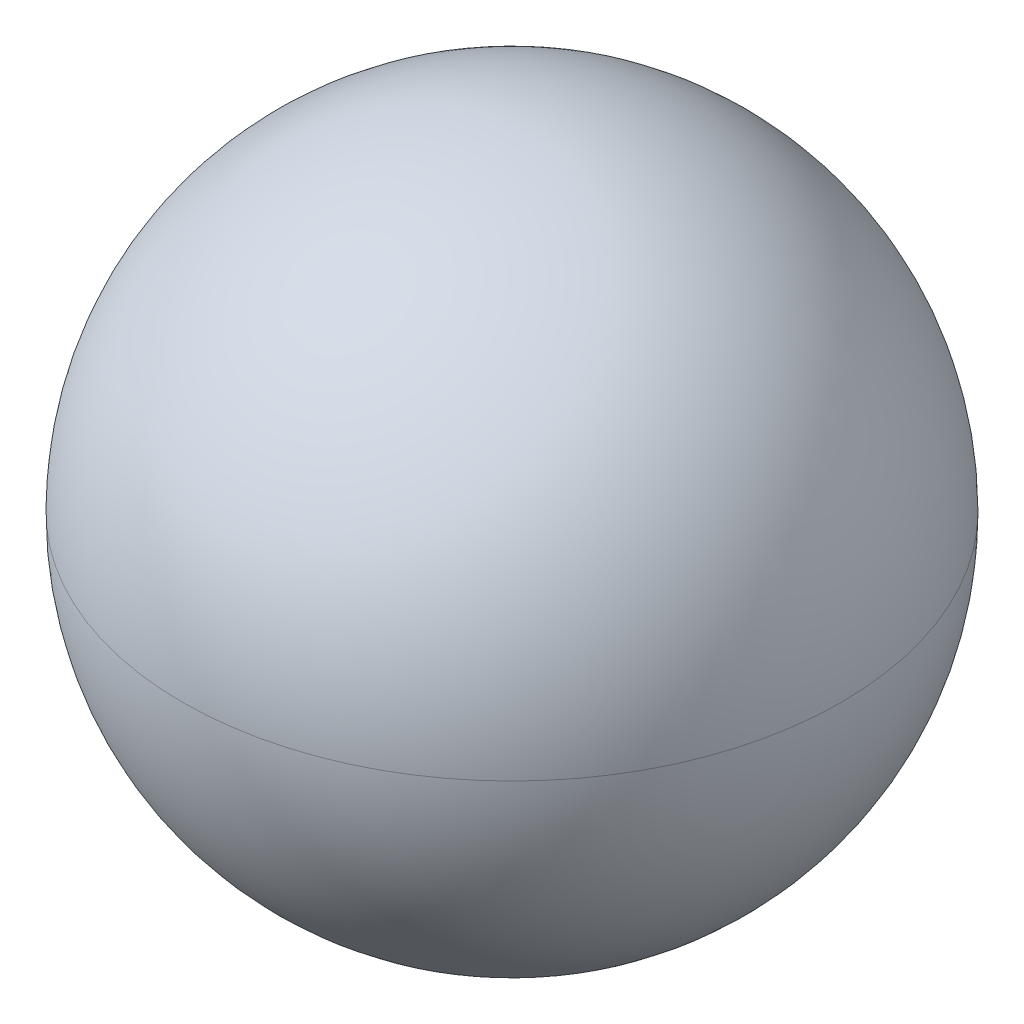
ISO-10303-21;
HEADER;
FILE_DESCRIPTION(('STEP AP214'),'2;1');
FILE_NAME('part.step','',(''),(''),'','','');
FILE_SCHEMA(('AUTOMOTIVE_DESIGN { 1 0 10303 214 1 1 1 1 }'));
ENDSEC;
DATA;
#1=APPLICATION_CONTEXT('core data for automotive mechanical design processes');
#2=APPLICATION_PROTOCOL_DEFINITION('international standard','automotive_design',2000,#1);
#3=PRODUCT_CONTEXT('',#1,'mechanical');
#4=PRODUCT('Part','Part','',(#3));
#5=PRODUCT_RELATED_PRODUCT_CATEGORY('part','',(#4));
#6=PRODUCT_DEFINITION_FORMATION('','',#4);
#7=PRODUCT_DEFINITION_CONTEXT('part definition',#1,'design');
#8=PRODUCT_DEFINITION('design','',#6,#7);
#9=PRODUCT_DEFINITION_SHAPE('','',#8);
#10=(LENGTH_UNIT() NAMED_UNIT(*) SI_UNIT(.MILLI.,.METRE.));
#11=(NAMED_UNIT(*) PLANE_ANGLE_UNIT() SI_UNIT($,.RADIAN.));
#12=(NAMED_UNIT(*) SI_UNIT($,.STERADIAN.) SOLID_ANGLE_UNIT());
#13=UNCERTAINTY_MEASURE_WITH_UNIT(LENGTH_MEASURE(1.E-05),#10,'distance_accuracy_value','');
#14=(GEOMETRIC_REPRESENTATION_CONTEXT(3) GLOBAL_UNCERTAINTY_ASSIGNED_CONTEXT((#13)) GLOBAL_UNIT_ASSIGNED_CONTEXT((#10,
#11,#12)) REPRESENTATION_CONTEXT('',''));
#15=CARTESIAN_POINT('',(0.,0.,0.));
#16=DIRECTION('',(0.,0.,1.));
#17=DIRECTION('',(1.,0.,0.));
#18=AXIS2_PLACEMENT_3D('',#15,#16,#17);
#19=CARTESIAN_POINT('',(0.,0.,0.));
#20=DIRECTION('',(0.,-1.,0.));
#21=DIRECTION('',(1.,0.,0.));
#22=AXIS2_PLACEMENT_3D('',#19,#20,#21);
#23=SPHERICAL_SURFACE('',#22,20.05);
#24=CARTESIAN_POINT('',(0.,0.,0.));
#25=DIRECTION('',(0.,1.,0.));
#26=DIRECTION('',(0.,0.,1.));
#27=AXIS2_PLACEMENT_3D('',#24,#25,#26);
#28=CIRCLE('',#27,20.05);
#29=CARTESIAN_POINT('',(0.,0.,20.05));
#30=VERTEX_POINT('',#29);
#31=CARTESIAN_POINT('',(0.,0.,-20.05));
#32=VERTEX_POINT('',#31);
#33=EDGE_CURVE('E27',#30,#32,#28,.T.);
#34=ORIENTED_EDGE('',*,*,#33,.F.);
#35=CARTESIAN_POINT('',(0.,0.,0.));
#36=DIRECTION('',(0.,-1.,0.));
#37=DIRECTION('',(1.,0.,0.));
#38=AXIS2_PLACEMENT_3D('',#35,#36,#37);
#39=CIRCLE('',#38,20.05);
#40=EDGE_CURVE('E10',#30,#32,#39,.T.);
#41=ORIENTED_EDGE('',*,*,#40,.T.);
#42=EDGE_LOOP('',(#34,#41));
#43=FACE_BOUND('',#42,.T.);
#44=ADVANCED_FACE('F16',(#43),#23,.T.);
#45=CARTESIAN_POINT('',(0.,0.,0.));
#46=DIRECTION('',(0.,-1.,0.));
#47=DIRECTION('',(1.,0.,0.));
#48=AXIS2_PLACEMENT_3D('',#45,#46,#47);
#49=SPHERICAL_SURFACE('',#48,20.05);
#50=ORIENTED_EDGE('',*,*,#40,.F.);
#51=ORIENTED_EDGE('',*,*,#33,.T.);
#52=EDGE_LOOP('',(#50,#51));
#53=FACE_BOUND('',#52,.T.);
#54=ADVANCED_FACE('F96',(#53),#49,.T.);
#55=CLOSED_SHELL('',(#44,#54));
#56=CARTESIAN_POINT('',(0.,0.,0.));
#57=DIRECTION('',(0.,-1.,0.));
#58=DIRECTION('',(1.,0.,0.));
#59=AXIS2_PLACEMENT_3D('',#56,#57,#58);
#60=SPHERICAL_SURFACE('',#59,19.5);
#61=CARTESIAN_POINT('',(0.,0.,0.));
#62=DIRECTION('',(0.,1.,0.));
#63=DIRECTION('',(0.,0.,1.));
#64=AXIS2_PLACEMENT_3D('',#61,#62,#63);
#65=CIRCLE('',#64,19.5);
#66=CARTESIAN_POINT('',(0.,0.,19.5));
#67=VERTEX_POINT('',#66);
#68=CARTESIAN_POINT('',(0.,0.,-19.5));
#69=VERTEX_POINT('',#68);
#70=EDGE_CURVE('E50',#67,#69,#65,.T.);
#71=ORIENTED_EDGE('',*,*,#70,.T.);
#72=CARTESIAN_POINT('',(0.,0.,0.));
#73=DIRECTION('',(0.,-1.,0.));
#74=DIRECTION('',(1.,0.,0.));
#75=AXIS2_PLACEMENT_3D('',#72,#73,#74);
#76=CIRCLE('',#75,19.5);
#77=EDGE_CURVE('E20',#67,#69,#76,.T.);
#78=ORIENTED_EDGE('',*,*,#77,.F.);
#79=EDGE_LOOP('',(#71,#78));
#80=FACE_BOUND('',#79,.T.);
#81=ADVANCED_FACE('F18',(#80),#60,.F.);
#82=CARTESIAN_POINT('',(0.,0.,0.));
#83=DIRECTION('',(0.,-1.,0.));
#84=DIRECTION('',(1.,0.,0.));
#85=AXIS2_PLACEMENT_3D('',#82,#83,#84);
#86=SPHERICAL_SURFACE('',#85,19.5);
#87=ORIENTED_EDGE('',*,*,#77,.T.);
#88=ORIENTED_EDGE('',*,*,#70,.F.);
#89=EDGE_LOOP('',(#87,#88));
#90=FACE_BOUND('',#89,.T.);
#91=ADVANCED_FACE('F56',(#90),#86,.F.);
#92=CLOSED_SHELL('',(#81,#91));
#93=ORIENTED_CLOSED_SHELL('',*,#92,.T.);
#94=BREP_WITH_VOIDS('B1',#55,(#93));
#95=ADVANCED_BREP_SHAPE_REPRESENTATION('',(#18,#94),#14);
#96=SHAPE_DEFINITION_REPRESENTATION(#9,#95);
ENDSEC;
END-ISO-10303-21;
